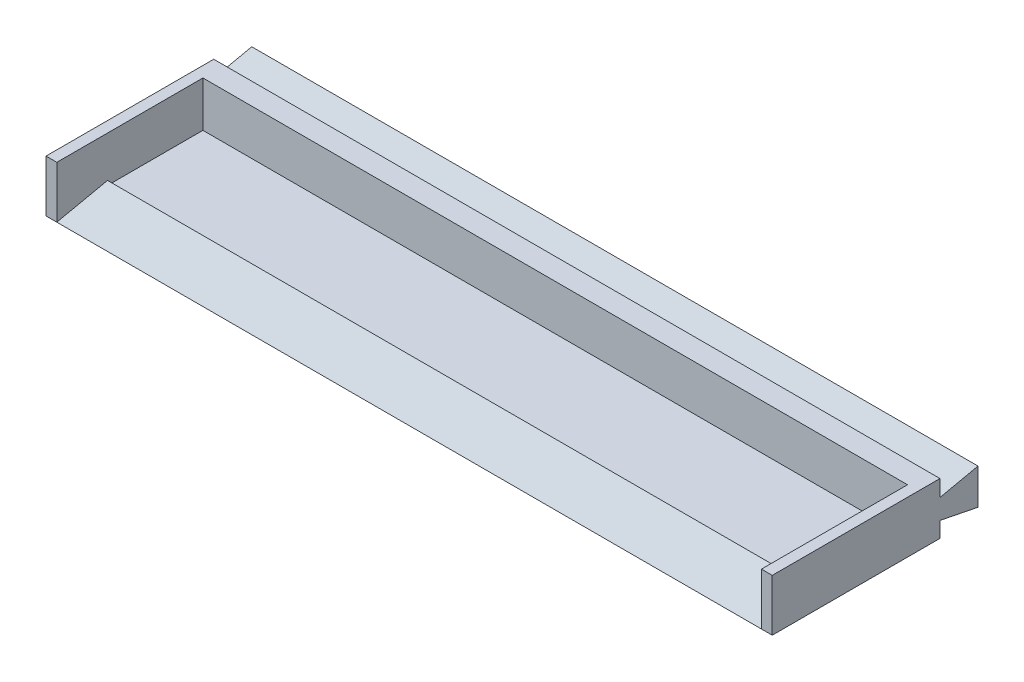
ISO-10303-21;
HEADER;
FILE_DESCRIPTION(('STEP AP214'),'2;1');
FILE_NAME('part.step','',(''),(''),'','','');
FILE_SCHEMA(('AUTOMOTIVE_DESIGN { 1 0 10303 214 1 1 1 1 }'));
ENDSEC;
DATA;
#1=APPLICATION_CONTEXT('core data for automotive mechanical design processes');
#2=APPLICATION_PROTOCOL_DEFINITION('international standard','automotive_design',2000,#1);
#3=PRODUCT_CONTEXT('',#1,'mechanical');
#4=PRODUCT('Part','Part','',(#3));
#5=PRODUCT_RELATED_PRODUCT_CATEGORY('part','',(#4));
#6=PRODUCT_DEFINITION_FORMATION('','',#4);
#7=PRODUCT_DEFINITION_CONTEXT('part definition',#1,'design');
#8=PRODUCT_DEFINITION('design','',#6,#7);
#9=PRODUCT_DEFINITION_SHAPE('','',#8);
#10=(LENGTH_UNIT() NAMED_UNIT(*) SI_UNIT(.MILLI.,.METRE.));
#11=(NAMED_UNIT(*) PLANE_ANGLE_UNIT() SI_UNIT($,.RADIAN.));
#12=(NAMED_UNIT(*) SI_UNIT($,.STERADIAN.) SOLID_ANGLE_UNIT());
#13=UNCERTAINTY_MEASURE_WITH_UNIT(LENGTH_MEASURE(1.E-05),#10,'distance_accuracy_value','');
#14=(GEOMETRIC_REPRESENTATION_CONTEXT(3) GLOBAL_UNCERTAINTY_ASSIGNED_CONTEXT((#13)) GLOBAL_UNIT_ASSIGNED_CONTEXT((#10,
#11,#12)) REPRESENTATION_CONTEXT('',''));
#15=CARTESIAN_POINT('',(0.,0.,0.));
#16=DIRECTION('',(0.,0.,1.));
#17=DIRECTION('',(1.,0.,0.));
#18=AXIS2_PLACEMENT_3D('',#15,#16,#17);
#19=CARTESIAN_POINT('',(0.,0.,0.));
#20=DIRECTION('',(0.,-1.,0.));
#21=DIRECTION('',(0.,0.,-1.));
#22=AXIS2_PLACEMENT_3D('',#19,#20,#21);
#23=PLANE('',#22);
#24=DIRECTION('',(0.,0.,1.));
#25=VECTOR('',#24,1.);
#26=CARTESIAN_POINT('',(-2.5,0.,-38.8));
#27=LINE('',#26,#25);
#28=CARTESIAN_POINT('',(-2.5,0.,-38.8));
#29=VERTEX_POINT('',#28);
#30=CARTESIAN_POINT('',(-2.5,0.,0.));
#31=VERTEX_POINT('',#30);
#32=EDGE_CURVE('E234',#29,#31,#27,.T.);
#33=ORIENTED_EDGE('',*,*,#32,.F.);
#34=DIRECTION('',(1.,0.,0.));
#35=VECTOR('',#34,1.);
#36=CARTESIAN_POINT('',(-2.5,0.,-38.8));
#37=LINE('',#36,#35);
#38=CARTESIAN_POINT('',(165.5,0.,-38.8));
#39=VERTEX_POINT('',#38);
#40=EDGE_CURVE('E184',#29,#39,#37,.T.);
#41=ORIENTED_EDGE('',*,*,#40,.T.);
#42=DIRECTION('',(0.,0.,-1.));
#43=VECTOR('',#42,1.);
#44=CARTESIAN_POINT('',(165.5,0.,0.));
#45=LINE('',#44,#43);
#46=CARTESIAN_POINT('',(165.5,0.,0.));
#47=VERTEX_POINT('',#46);
#48=EDGE_CURVE('E212',#47,#39,#45,.T.);
#49=ORIENTED_EDGE('',*,*,#48,.F.);
#50=DIRECTION('',(-1.,0.,0.));
#51=VECTOR('',#50,1.);
#52=CARTESIAN_POINT('',(165.5,0.,0.));
#53=LINE('',#52,#51);
#54=CARTESIAN_POINT('',(163.,0.,0.));
#55=VERTEX_POINT('',#54);
#56=EDGE_CURVE('E229',#47,#55,#53,.T.);
#57=ORIENTED_EDGE('',*,*,#56,.T.);
#58=DIRECTION('',(1.,0.,0.));
#59=VECTOR('',#58,1.);
#60=CARTESIAN_POINT('',(0.,0.,0.));
#61=LINE('',#60,#59);
#62=CARTESIAN_POINT('',(0.,0.,0.));
#63=VERTEX_POINT('',#62);
#64=EDGE_CURVE('E11',#63,#55,#61,.T.);
#65=ORIENTED_EDGE('',*,*,#64,.F.);
#66=DIRECTION('',(1.,0.,0.));
#67=VECTOR('',#66,1.);
#68=CARTESIAN_POINT('',(-2.5,0.,0.));
#69=LINE('',#68,#67);
#70=EDGE_CURVE('E252',#31,#63,#69,.T.);
#71=ORIENTED_EDGE('',*,*,#70,.F.);
#72=EDGE_LOOP('',(#33,#41,#49,#57,#65,#71));
#73=FACE_BOUND('',#72,.T.);
#74=ADVANCED_FACE('F41',(#73),#23,.T.);
#75=CARTESIAN_POINT('',(-2.5,0.,0.));
#76=DIRECTION('',(-1.,0.,0.));
#77=DIRECTION('',(0.,0.,1.));
#78=AXIS2_PLACEMENT_3D('',#75,#76,#77);
#79=PLANE('',#78);
#80=DIRECTION('',(0.,-1.,0.));
#81=VECTOR('',#80,1.);
#82=CARTESIAN_POINT('',(-2.5,0.,-38.8));
#83=LINE('',#82,#81);
#84=CARTESIAN_POINT('',(-2.5,12.,-38.8));
#85=VERTEX_POINT('',#84);
#86=CARTESIAN_POINT('',(-2.5,8.2,-38.8));
#87=VERTEX_POINT('',#86);
#88=EDGE_CURVE('E151',#85,#87,#83,.T.);
#89=ORIENTED_EDGE('',*,*,#88,.T.);
#90=DIRECTION('',(0.,-0.211045983510885,0.977476134155675));
#91=VECTOR('',#90,1.);
#92=CARTESIAN_POINT('',(-2.5,-0.169376927822338,-0.0365700185070956));
#93=LINE('',#92,#91);
#94=CARTESIAN_POINT('',(-2.5,10.1,-47.6));
#95=VERTEX_POINT('',#94);
#96=EDGE_CURVE('E140',#95,#87,#93,.T.);
#97=ORIENTED_EDGE('',*,*,#96,.F.);
#98=DIRECTION('',(0.,1.,0.));
#99=VECTOR('',#98,1.);
#100=CARTESIAN_POINT('',(-2.5,12.,-47.6));
#101=LINE('',#100,#99);
#102=CARTESIAN_POINT('',(-2.5,1.84,-47.6));
#103=VERTEX_POINT('',#102);
#104=EDGE_CURVE('E204',#103,#95,#101,.T.);
#105=ORIENTED_EDGE('',*,*,#104,.F.);
#106=DIRECTION('',(0.,-0.196116135138184,-0.98058067569092));
#107=VECTOR('',#106,1.);
#108=CARTESIAN_POINT('',(-2.5,10.9230769230769,-2.18461538461538));
#109=LINE('',#108,#107);
#110=CARTESIAN_POINT('',(-2.5,3.6,-38.8));
#111=VERTEX_POINT('',#110);
#112=EDGE_CURVE('E56',#111,#103,#109,.T.);
#113=ORIENTED_EDGE('',*,*,#112,.F.);
#114=DIRECTION('',(0.,1.,0.));
#115=VECTOR('',#114,1.);
#116=CARTESIAN_POINT('',(-2.5,0.,-38.8));
#117=LINE('',#116,#115);
#118=EDGE_CURVE('E178',#29,#111,#117,.T.);
#119=ORIENTED_EDGE('',*,*,#118,.F.);
#120=ORIENTED_EDGE('',*,*,#32,.T.);
#121=DIRECTION('',(0.,1.,0.));
#122=VECTOR('',#121,1.);
#123=CARTESIAN_POINT('',(-2.5,12.,0.));
#124=LINE('',#123,#122);
#125=CARTESIAN_POINT('',(-2.5,12.,0.));
#126=VERTEX_POINT('',#125);
#127=EDGE_CURVE('E237',#31,#126,#124,.T.);
#128=ORIENTED_EDGE('',*,*,#127,.T.);
#129=DIRECTION('',(0.,0.,-1.));
#130=VECTOR('',#129,1.);
#131=CARTESIAN_POINT('',(-2.5,12.,-38.8));
#132=LINE('',#131,#130);
#133=EDGE_CURVE('E163',#126,#85,#132,.T.);
#134=ORIENTED_EDGE('',*,*,#133,.T.);
#135=EDGE_LOOP('',(#89,#97,#105,#113,#119,#120,#128,#134));
#136=FACE_BOUND('',#135,.T.);
#137=ADVANCED_FACE('F161',(#136),#79,.T.);
#138=CARTESIAN_POINT('',(165.5,0.,0.));
#139=DIRECTION('',(-1.,0.,0.));
#140=DIRECTION('',(0.,0.,1.));
#141=AXIS2_PLACEMENT_3D('',#138,#139,#140);
#142=PLANE('',#141);
#143=DIRECTION('',(0.,-0.211045983510885,0.977476134155675));
#144=VECTOR('',#143,1.);
#145=CARTESIAN_POINT('',(165.5,-0.169376927822338,-0.0365700185070956));
#146=LINE('',#145,#144);
#147=CARTESIAN_POINT('',(165.5,10.1,-47.6));
#148=VERTEX_POINT('',#147);
#149=CARTESIAN_POINT('',(165.5,8.2,-38.8));
#150=VERTEX_POINT('',#149);
#151=EDGE_CURVE('E64',#148,#150,#146,.T.);
#152=ORIENTED_EDGE('',*,*,#151,.T.);
#153=DIRECTION('',(0.,-1.,0.));
#154=VECTOR('',#153,1.);
#155=CARTESIAN_POINT('',(165.5,0.,-38.8));
#156=LINE('',#155,#154);
#157=CARTESIAN_POINT('',(165.5,12.,-38.8));
#158=VERTEX_POINT('',#157);
#159=EDGE_CURVE('E157',#158,#150,#156,.T.);
#160=ORIENTED_EDGE('',*,*,#159,.F.);
#161=DIRECTION('',(0.,0.,1.));
#162=VECTOR('',#161,1.);
#163=CARTESIAN_POINT('',(165.5,12.,0.));
#164=LINE('',#163,#162);
#165=CARTESIAN_POINT('',(165.5,12.,0.));
#166=VERTEX_POINT('',#165);
#167=EDGE_CURVE('E217',#158,#166,#164,.T.);
#168=ORIENTED_EDGE('',*,*,#167,.T.);
#169=DIRECTION('',(0.,-1.,0.));
#170=VECTOR('',#169,1.);
#171=CARTESIAN_POINT('',(165.5,0.,0.));
#172=LINE('',#171,#170);
#173=EDGE_CURVE('E208',#166,#47,#172,.T.);
#174=ORIENTED_EDGE('',*,*,#173,.T.);
#175=ORIENTED_EDGE('',*,*,#48,.T.);
#176=DIRECTION('',(0.,1.,0.));
#177=VECTOR('',#176,1.);
#178=CARTESIAN_POINT('',(165.5,0.,-38.8));
#179=LINE('',#178,#177);
#180=CARTESIAN_POINT('',(165.5,3.6,-38.8));
#181=VERTEX_POINT('',#180);
#182=EDGE_CURVE('E185',#39,#181,#179,.T.);
#183=ORIENTED_EDGE('',*,*,#182,.T.);
#184=DIRECTION('',(0.,-0.196116135138184,-0.98058067569092));
#185=VECTOR('',#184,1.);
#186=CARTESIAN_POINT('',(165.5,10.9230769230769,-2.18461538461538));
#187=LINE('',#186,#185);
#188=CARTESIAN_POINT('',(165.5,1.84,-47.6));
#189=VERTEX_POINT('',#188);
#190=EDGE_CURVE('E181',#181,#189,#187,.T.);
#191=ORIENTED_EDGE('',*,*,#190,.T.);
#192=DIRECTION('',(0.,-1.,0.));
#193=VECTOR('',#192,1.);
#194=CARTESIAN_POINT('',(165.5,12.,-47.6));
#195=LINE('',#194,#193);
#196=EDGE_CURVE('E175',#148,#189,#195,.T.);
#197=ORIENTED_EDGE('',*,*,#196,.F.);
#198=EDGE_LOOP('',(#152,#160,#168,#174,#175,#183,#191,#197));
#199=FACE_BOUND('',#198,.T.);
#200=ADVANCED_FACE('F337',(#199),#142,.F.);
#201=CARTESIAN_POINT('',(0.,0.,-47.6));
#202=DIRECTION('',(0.,0.,-1.));
#203=DIRECTION('',(-1.,0.,0.));
#204=AXIS2_PLACEMENT_3D('',#201,#202,#203);
#205=PLANE('',#204);
#206=ORIENTED_EDGE('',*,*,#104,.T.);
#207=DIRECTION('',(1.,0.,0.));
#208=VECTOR('',#207,1.);
#209=CARTESIAN_POINT('',(-2.5,10.1,-47.6));
#210=LINE('',#209,#208);
#211=EDGE_CURVE('E145',#95,#148,#210,.T.);
#212=ORIENTED_EDGE('',*,*,#211,.T.);
#213=ORIENTED_EDGE('',*,*,#196,.T.);
#214=DIRECTION('',(1.,0.,0.));
#215=VECTOR('',#214,1.);
#216=CARTESIAN_POINT('',(-2.5,1.84,-47.6));
#217=LINE('',#216,#215);
#218=EDGE_CURVE('E195',#103,#189,#217,.T.);
#219=ORIENTED_EDGE('',*,*,#218,.F.);
#220=EDGE_LOOP('',(#206,#212,#213,#219));
#221=FACE_BOUND('',#220,.T.);
#222=ADVANCED_FACE('F340',(#221),#205,.T.);
#223=CARTESIAN_POINT('',(-5.,1.5,-11.7366945943055));
#224=DIRECTION('',(0.,-1.,0.));
#225=DIRECTION('',(0.,0.,-1.));
#226=AXIS2_PLACEMENT_3D('',#223,#224,#225);
#227=PLANE('',#226);
#228=DIRECTION('',(1.,0.,0.));
#229=VECTOR('',#228,1.);
#230=CARTESIAN_POINT('',(0.,1.5,-33.8));
#231=LINE('',#230,#229);
#232=CARTESIAN_POINT('',(0.,1.5,-33.8));
#233=VERTEX_POINT('',#232);
#234=CARTESIAN_POINT('',(163.,1.5,-33.8));
#235=VERTEX_POINT('',#234);
#236=EDGE_CURVE('E255',#233,#235,#231,.T.);
#237=ORIENTED_EDGE('',*,*,#236,.F.);
#238=DIRECTION('',(0.,0.,-1.));
#239=VECTOR('',#238,1.);
#240=CARTESIAN_POINT('',(0.,1.5,0.));
#241=LINE('',#240,#239);
#242=CARTESIAN_POINT('',(0.,1.5,-11.7366945943055));
#243=VERTEX_POINT('',#242);
#244=EDGE_CURVE('E283',#243,#233,#241,.T.);
#245=ORIENTED_EDGE('',*,*,#244,.F.);
#246=DIRECTION('',(1.,0.,0.));
#247=VECTOR('',#246,1.);
#248=CARTESIAN_POINT('',(-5.,1.5,-11.7366945943055));
#249=LINE('',#248,#247);
#250=CARTESIAN_POINT('',(163.,1.5,-11.7366945943055));
#251=VERTEX_POINT('',#250);
#252=EDGE_CURVE('E277',#243,#251,#249,.T.);
#253=ORIENTED_EDGE('',*,*,#252,.T.);
#254=DIRECTION('',(0.,0.,-1.));
#255=VECTOR('',#254,1.);
#256=CARTESIAN_POINT('',(163.,1.5,-11.7366945943055));
#257=LINE('',#256,#255);
#258=EDGE_CURVE('E274',#251,#235,#257,.T.);
#259=ORIENTED_EDGE('',*,*,#258,.T.);
#260=EDGE_LOOP('',(#237,#245,#253,#259));
#261=FACE_BOUND('',#260,.T.);
#262=ADVANCED_FACE('F317',(#261),#227,.F.);
#263=CARTESIAN_POINT('',(-5.,0.,0.));
#264=DIRECTION('',(0.,-0.978057882858792,-0.208333333333333));
#265=DIRECTION('',(0.,0.208333333333333,-0.978057882858792));
#266=AXIS2_PLACEMENT_3D('',#263,#264,#265);
#267=PLANE('',#266);
#268=ORIENTED_EDGE('',*,*,#64,.T.);
#269=DIRECTION('',(0.,0.208333333333333,-0.978057882858792));
#270=VECTOR('',#269,1.);
#271=CARTESIAN_POINT('',(163.,0.,0.));
#272=LINE('',#271,#270);
#273=CARTESIAN_POINT('',(163.,2.5,-11.7366945943055));
#274=VERTEX_POINT('',#273);
#275=EDGE_CURVE('E286',#55,#274,#272,.T.);
#276=ORIENTED_EDGE('',*,*,#275,.T.);
#277=DIRECTION('',(1.,0.,0.));
#278=VECTOR('',#277,1.);
#279=CARTESIAN_POINT('',(-5.,2.5,-11.7366945943055));
#280=LINE('',#279,#278);
#281=CARTESIAN_POINT('',(0.,2.5,-11.7366945943055));
#282=VERTEX_POINT('',#281);
#283=EDGE_CURVE('E290',#282,#274,#280,.T.);
#284=ORIENTED_EDGE('',*,*,#283,.F.);
#285=DIRECTION('',(0.,0.208333333333333,-0.978057882858792));
#286=VECTOR('',#285,1.);
#287=CARTESIAN_POINT('',(0.,0.108506944444444,-0.509405147322287));
#288=LINE('',#287,#286);
#289=EDGE_CURVE('E49',#63,#282,#288,.T.);
#290=ORIENTED_EDGE('',*,*,#289,.F.);
#291=EDGE_LOOP('',(#268,#276,#284,#290));
#292=FACE_BOUND('',#291,.T.);
#293=ADVANCED_FACE('F306',(#292),#267,.F.);
#294=CARTESIAN_POINT('',(-5.,2.5,-11.7366945943055));
#295=DIRECTION('',(0.,0.,1.));
#296=DIRECTION('',(1.,0.,0.));
#297=AXIS2_PLACEMENT_3D('',#294,#295,#296);
#298=PLANE('',#297);
#299=ORIENTED_EDGE('',*,*,#283,.T.);
#300=DIRECTION('',(0.,-1.,0.));
#301=VECTOR('',#300,1.);
#302=CARTESIAN_POINT('',(163.,2.5,-11.7366945943055));
#303=LINE('',#302,#301);
#304=EDGE_CURVE('E270',#274,#251,#303,.T.);
#305=ORIENTED_EDGE('',*,*,#304,.T.);
#306=ORIENTED_EDGE('',*,*,#252,.F.);
#307=DIRECTION('',(0.,-1.,0.));
#308=VECTOR('',#307,1.);
#309=CARTESIAN_POINT('',(0.,2.5,-11.7366945943055));
#310=LINE('',#309,#308);
#311=EDGE_CURVE('E280',#282,#243,#310,.T.);
#312=ORIENTED_EDGE('',*,*,#311,.F.);
#313=EDGE_LOOP('',(#299,#305,#306,#312));
#314=FACE_BOUND('',#313,.T.);
#315=ADVANCED_FACE('F305',(#314),#298,.F.);
#316=CARTESIAN_POINT('',(0.,12.,-33.8));
#317=DIRECTION('',(0.,0.,-1.));
#318=DIRECTION('',(-1.,0.,0.));
#319=AXIS2_PLACEMENT_3D('',#316,#317,#318);
#320=PLANE('',#319);
#321=ORIENTED_EDGE('',*,*,#236,.T.);
#322=DIRECTION('',(0.,-1.,0.));
#323=VECTOR('',#322,1.);
#324=CARTESIAN_POINT('',(163.,12.,-33.8));
#325=LINE('',#324,#323);
#326=CARTESIAN_POINT('',(163.,12.,-33.8));
#327=VERTEX_POINT('',#326);
#328=EDGE_CURVE('E259',#327,#235,#325,.T.);
#329=ORIENTED_EDGE('',*,*,#328,.F.);
#330=DIRECTION('',(1.,0.,0.));
#331=VECTOR('',#330,1.);
#332=CARTESIAN_POINT('',(0.,12.,-33.8));
#333=LINE('',#332,#331);
#334=CARTESIAN_POINT('',(0.,12.,-33.8));
#335=VERTEX_POINT('',#334);
#336=EDGE_CURVE('E256',#335,#327,#333,.T.);
#337=ORIENTED_EDGE('',*,*,#336,.F.);
#338=DIRECTION('',(0.,-1.,0.));
#339=VECTOR('',#338,1.);
#340=CARTESIAN_POINT('',(0.,12.,-33.8));
#341=LINE('',#340,#339);
#342=EDGE_CURVE('E266',#335,#233,#341,.T.);
#343=ORIENTED_EDGE('',*,*,#342,.T.);
#344=EDGE_LOOP('',(#321,#329,#337,#343));
#345=FACE_BOUND('',#344,.T.);
#346=ADVANCED_FACE('F319',(#345),#320,.F.);
#347=CARTESIAN_POINT('',(0.,12.,0.));
#348=DIRECTION('',(0.,1.,0.));
#349=DIRECTION('',(0.,0.,1.));
#350=AXIS2_PLACEMENT_3D('',#347,#348,#349);
#351=PLANE('',#350);
#352=DIRECTION('',(1.,0.,0.));
#353=VECTOR('',#352,1.);
#354=CARTESIAN_POINT('',(-2.5,12.,-38.8));
#355=LINE('',#354,#353);
#356=EDGE_CURVE('E172',#85,#158,#355,.T.);
#357=ORIENTED_EDGE('',*,*,#356,.F.);
#358=ORIENTED_EDGE('',*,*,#133,.F.);
#359=DIRECTION('',(1.,0.,0.));
#360=VECTOR('',#359,1.);
#361=CARTESIAN_POINT('',(-2.5,12.,0.));
#362=LINE('',#361,#360);
#363=CARTESIAN_POINT('',(0.,12.,0.));
#364=VERTEX_POINT('',#363);
#365=EDGE_CURVE('E243',#126,#364,#362,.T.);
#366=ORIENTED_EDGE('',*,*,#365,.T.);
#367=DIRECTION('',(0.,0.,-1.));
#368=VECTOR('',#367,1.);
#369=CARTESIAN_POINT('',(0.,12.,-38.8));
#370=LINE('',#369,#368);
#371=EDGE_CURVE('E238',#364,#335,#370,.T.);
#372=ORIENTED_EDGE('',*,*,#371,.T.);
#373=ORIENTED_EDGE('',*,*,#336,.T.);
#374=DIRECTION('',(0.,0.,1.));
#375=VECTOR('',#374,1.);
#376=CARTESIAN_POINT('',(163.,12.,0.));
#377=LINE('',#376,#375);
#378=CARTESIAN_POINT('',(163.,12.,0.));
#379=VERTEX_POINT('',#378);
#380=EDGE_CURVE('E213',#327,#379,#377,.T.);
#381=ORIENTED_EDGE('',*,*,#380,.T.);
#382=DIRECTION('',(-1.,0.,0.));
#383=VECTOR('',#382,1.);
#384=CARTESIAN_POINT('',(165.5,12.,0.));
#385=LINE('',#384,#383);
#386=EDGE_CURVE('E220',#166,#379,#385,.T.);
#387=ORIENTED_EDGE('',*,*,#386,.F.);
#388=ORIENTED_EDGE('',*,*,#167,.F.);
#389=EDGE_LOOP('',(#357,#358,#366,#372,#373,#381,#387,#388));
#390=FACE_BOUND('',#389,.T.);
#391=ADVANCED_FACE('F322',(#390),#351,.T.);
#392=CARTESIAN_POINT('',(0.,0.,0.));
#393=DIRECTION('',(-1.,0.,0.));
#394=DIRECTION('',(0.,0.,1.));
#395=AXIS2_PLACEMENT_3D('',#392,#393,#394);
#396=PLANE('',#395);
#397=DIRECTION('',(0.,1.,0.));
#398=VECTOR('',#397,1.);
#399=CARTESIAN_POINT('',(0.,12.,0.));
#400=LINE('',#399,#398);
#401=EDGE_CURVE('E233',#63,#364,#400,.T.);
#402=ORIENTED_EDGE('',*,*,#401,.F.);
#403=ORIENTED_EDGE('',*,*,#289,.T.);
#404=ORIENTED_EDGE('',*,*,#311,.T.);
#405=ORIENTED_EDGE('',*,*,#244,.T.);
#406=ORIENTED_EDGE('',*,*,#342,.F.);
#407=ORIENTED_EDGE('',*,*,#371,.F.);
#408=EDGE_LOOP('',(#402,#403,#404,#405,#406,#407));
#409=FACE_BOUND('',#408,.T.);
#410=ADVANCED_FACE('F297',(#409),#396,.F.);
#411=CARTESIAN_POINT('',(-2.5,12.,0.));
#412=DIRECTION('',(0.,0.,-1.));
#413=DIRECTION('',(-1.,0.,0.));
#414=AXIS2_PLACEMENT_3D('',#411,#412,#413);
#415=PLANE('',#414);
#416=ORIENTED_EDGE('',*,*,#401,.T.);
#417=ORIENTED_EDGE('',*,*,#365,.F.);
#418=ORIENTED_EDGE('',*,*,#127,.F.);
#419=ORIENTED_EDGE('',*,*,#70,.T.);
#420=EDGE_LOOP('',(#416,#417,#418,#419));
#421=FACE_BOUND('',#420,.T.);
#422=ADVANCED_FACE('F326',(#421),#415,.F.);
#423=CARTESIAN_POINT('',(163.,0.,0.));
#424=DIRECTION('',(-1.,0.,0.));
#425=DIRECTION('',(0.,0.,1.));
#426=AXIS2_PLACEMENT_3D('',#423,#424,#425);
#427=PLANE('',#426);
#428=ORIENTED_EDGE('',*,*,#275,.F.);
#429=DIRECTION('',(0.,-1.,0.));
#430=VECTOR('',#429,1.);
#431=CARTESIAN_POINT('',(163.,0.,0.));
#432=LINE('',#431,#430);
#433=EDGE_CURVE('E207',#379,#55,#432,.T.);
#434=ORIENTED_EDGE('',*,*,#433,.F.);
#435=ORIENTED_EDGE('',*,*,#380,.F.);
#436=ORIENTED_EDGE('',*,*,#328,.T.);
#437=ORIENTED_EDGE('',*,*,#258,.F.);
#438=ORIENTED_EDGE('',*,*,#304,.F.);
#439=EDGE_LOOP('',(#428,#434,#435,#436,#437,#438));
#440=FACE_BOUND('',#439,.T.);
#441=ADVANCED_FACE('F312',(#440),#427,.T.);
#442=CARTESIAN_POINT('',(165.5,0.,0.));
#443=DIRECTION('',(0.,0.,-1.));
#444=DIRECTION('',(-1.,0.,0.));
#445=AXIS2_PLACEMENT_3D('',#442,#443,#444);
#446=PLANE('',#445);
#447=ORIENTED_EDGE('',*,*,#433,.T.);
#448=ORIENTED_EDGE('',*,*,#56,.F.);
#449=ORIENTED_EDGE('',*,*,#173,.F.);
#450=ORIENTED_EDGE('',*,*,#386,.T.);
#451=EDGE_LOOP('',(#447,#448,#449,#450));
#452=FACE_BOUND('',#451,.T.);
#453=ADVANCED_FACE('F333',(#452),#446,.F.);
#454=CARTESIAN_POINT('',(-2.5,0.,-38.8));
#455=DIRECTION('',(0.,0.,-1.));
#456=DIRECTION('',(-1.,0.,0.));
#457=AXIS2_PLACEMENT_3D('',#454,#455,#456);
#458=PLANE('',#457);
#459=ORIENTED_EDGE('',*,*,#182,.F.);
#460=ORIENTED_EDGE('',*,*,#40,.F.);
#461=ORIENTED_EDGE('',*,*,#118,.T.);
#462=DIRECTION('',(1.,0.,0.));
#463=VECTOR('',#462,1.);
#464=CARTESIAN_POINT('',(-2.5,3.6,-38.8));
#465=LINE('',#464,#463);
#466=EDGE_CURVE('E170',#111,#181,#465,.T.);
#467=ORIENTED_EDGE('',*,*,#466,.T.);
#468=EDGE_LOOP('',(#459,#460,#461,#467));
#469=FACE_BOUND('',#468,.T.);
#470=ADVANCED_FACE('F343',(#469),#458,.T.);
#471=CARTESIAN_POINT('',(-2.5,10.9230769230769,-2.18461538461538));
#472=DIRECTION('',(0.,-0.98058067569092,0.196116135138184));
#473=DIRECTION('',(0.,-0.196116135138184,-0.98058067569092));
#474=AXIS2_PLACEMENT_3D('',#471,#472,#473);
#475=PLANE('',#474);
#476=ORIENTED_EDGE('',*,*,#190,.F.);
#477=ORIENTED_EDGE('',*,*,#466,.F.);
#478=ORIENTED_EDGE('',*,*,#112,.T.);
#479=ORIENTED_EDGE('',*,*,#218,.T.);
#480=EDGE_LOOP('',(#476,#477,#478,#479));
#481=FACE_BOUND('',#480,.T.);
#482=ADVANCED_FACE('F344',(#481),#475,.T.);
#483=CARTESIAN_POINT('',(-2.5,0.,-38.8));
#484=DIRECTION('',(0.,0.,1.));
#485=DIRECTION('',(0.,-1.,0.));
#486=AXIS2_PLACEMENT_3D('',#483,#484,#485);
#487=PLANE('',#486);
#488=ORIENTED_EDGE('',*,*,#159,.T.);
#489=DIRECTION('',(1.,0.,0.));
#490=VECTOR('',#489,1.);
#491=CARTESIAN_POINT('',(-2.5,8.2,-38.8));
#492=LINE('',#491,#490);
#493=EDGE_CURVE('E143',#87,#150,#492,.T.);
#494=ORIENTED_EDGE('',*,*,#493,.F.);
#495=ORIENTED_EDGE('',*,*,#88,.F.);
#496=ORIENTED_EDGE('',*,*,#356,.T.);
#497=EDGE_LOOP('',(#488,#494,#495,#496));
#498=FACE_BOUND('',#497,.T.);
#499=ADVANCED_FACE('F154',(#498),#487,.F.);
#500=CARTESIAN_POINT('',(-2.5,-0.169376927822338,-0.0365700185070956));
#501=DIRECTION('',(0.,0.977476134155675,0.211045983510885));
#502=DIRECTION('',(0.,-0.211045983510885,0.977476134155675));
#503=AXIS2_PLACEMENT_3D('',#500,#501,#502);
#504=PLANE('',#503);
#505=ORIENTED_EDGE('',*,*,#151,.F.);
#506=ORIENTED_EDGE('',*,*,#211,.F.);
#507=ORIENTED_EDGE('',*,*,#96,.T.);
#508=ORIENTED_EDGE('',*,*,#493,.T.);
#509=EDGE_LOOP('',(#505,#506,#507,#508));
#510=FACE_BOUND('',#509,.T.);
#511=ADVANCED_FACE('F142',(#510),#504,.T.);
#512=CLOSED_SHELL('',(#74,#137,#200,#222,#262,#293,#315,#346,#391,#410,#422,#441,#453,#470,#482,
#499,#511));
#513=MANIFOLD_SOLID_BREP('B2',#512);
#514=ADVANCED_BREP_SHAPE_REPRESENTATION('',(#18,#513),#14);
#515=SHAPE_DEFINITION_REPRESENTATION(#9,#514);
ENDSEC;
END-ISO-10303-21;
